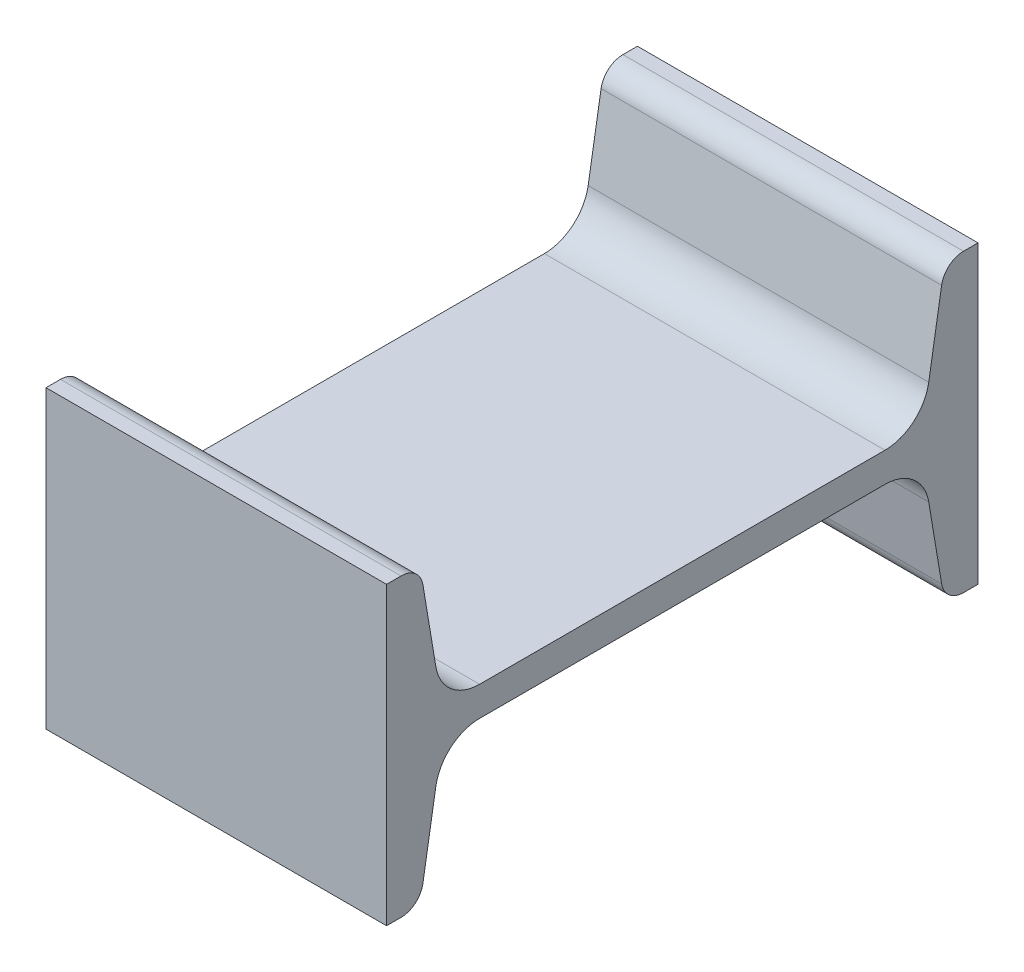
ISO-10303-21;
HEADER;
FILE_DESCRIPTION(('STEP AP214'),'2;1');
FILE_NAME('part.step','',(''),(''),'','','');
FILE_SCHEMA(('AUTOMOTIVE_DESIGN { 1 0 10303 214 1 1 1 1 }'));
ENDSEC;
DATA;
#1=APPLICATION_CONTEXT('core data for automotive mechanical design processes');
#2=APPLICATION_PROTOCOL_DEFINITION('international standard','automotive_design',2000,#1);
#3=PRODUCT_CONTEXT('',#1,'mechanical');
#4=PRODUCT('Part','Part','',(#3));
#5=PRODUCT_RELATED_PRODUCT_CATEGORY('part','',(#4));
#6=PRODUCT_DEFINITION_FORMATION('','',#4);
#7=PRODUCT_DEFINITION_CONTEXT('part definition',#1,'design');
#8=PRODUCT_DEFINITION('design','',#6,#7);
#9=PRODUCT_DEFINITION_SHAPE('','',#8);
#10=(LENGTH_UNIT() NAMED_UNIT(*) SI_UNIT(.MILLI.,.METRE.));
#11=(NAMED_UNIT(*) PLANE_ANGLE_UNIT() SI_UNIT($,.RADIAN.));
#12=(NAMED_UNIT(*) SI_UNIT($,.STERADIAN.) SOLID_ANGLE_UNIT());
#13=UNCERTAINTY_MEASURE_WITH_UNIT(LENGTH_MEASURE(1.E-05),#10,'distance_accuracy_value','');
#14=(GEOMETRIC_REPRESENTATION_CONTEXT(3) GLOBAL_UNCERTAINTY_ASSIGNED_CONTEXT((#13)) GLOBAL_UNIT_ASSIGNED_CONTEXT((#10,
#11,#12)) REPRESENTATION_CONTEXT('',''));
#15=CARTESIAN_POINT('',(0.,0.,0.));
#16=DIRECTION('',(0.,0.,1.));
#17=DIRECTION('',(1.,0.,0.));
#18=AXIS2_PLACEMENT_3D('',#15,#16,#17);
#19=CARTESIAN_POINT('',(46.0686109738013,20.,-40.));
#20=DIRECTION('',(0.,0.,1.));
#21=DIRECTION('',(1.,0.,0.));
#22=AXIS2_PLACEMENT_3D('',#19,#20,#21);
#23=PLANE('',#22);
#24=DIRECTION('',(0.,1.,0.));
#25=VECTOR('',#24,1.);
#26=CARTESIAN_POINT('',(0.,20.,-40.));
#27=LINE('',#26,#25);
#28=CARTESIAN_POINT('',(0.,-20.,-40.));
#29=VERTEX_POINT('',#28);
#30=CARTESIAN_POINT('',(0.,20.,-40.));
#31=VERTEX_POINT('',#30);
#32=EDGE_CURVE('E267',#29,#31,#27,.T.);
#33=ORIENTED_EDGE('',*,*,#32,.T.);
#34=DIRECTION('',(-1.,0.,0.));
#35=VECTOR('',#34,1.);
#36=CARTESIAN_POINT('',(46.0686109738013,20.,-40.));
#37=LINE('',#36,#35);
#38=CARTESIAN_POINT('',(46.0686109738013,20.,-40.));
#39=VERTEX_POINT('',#38);
#40=EDGE_CURVE('E13',#39,#31,#37,.T.);
#41=ORIENTED_EDGE('',*,*,#40,.F.);
#42=DIRECTION('',(0.,1.,0.));
#43=VECTOR('',#42,1.);
#44=CARTESIAN_POINT('',(46.0686109738013,20.,-40.));
#45=LINE('',#44,#43);
#46=CARTESIAN_POINT('',(46.0686109738013,-20.,-40.));
#47=VERTEX_POINT('',#46);
#48=EDGE_CURVE('E305',#47,#39,#45,.T.);
#49=ORIENTED_EDGE('',*,*,#48,.F.);
#50=DIRECTION('',(-1.,0.,0.));
#51=VECTOR('',#50,1.);
#52=CARTESIAN_POINT('',(46.0686109738013,-20.,-40.));
#53=LINE('',#52,#51);
#54=EDGE_CURVE('E263',#47,#29,#53,.T.);
#55=ORIENTED_EDGE('',*,*,#54,.T.);
#56=EDGE_LOOP('',(#33,#41,#49,#55));
#57=FACE_BOUND('',#56,.T.);
#58=ADVANCED_FACE('F99',(#57),#23,.F.);
#59=CARTESIAN_POINT('',(46.0686109738013,20.,-38.0414602103931));
#60=DIRECTION('',(0.,-1.,0.));
#61=DIRECTION('',(0.,0.,-1.));
#62=AXIS2_PLACEMENT_3D('',#59,#60,#61);
#63=PLANE('',#62);
#64=DIRECTION('',(0.,0.,1.));
#65=VECTOR('',#64,1.);
#66=CARTESIAN_POINT('',(0.,20.,-38.0414602103931));
#67=LINE('',#66,#65);
#68=CARTESIAN_POINT('',(0.,20.,-38.0414602103931));
#69=VERTEX_POINT('',#68);
#70=EDGE_CURVE('E270',#31,#69,#67,.T.);
#71=ORIENTED_EDGE('',*,*,#70,.T.);
#72=DIRECTION('',(-1.,0.,0.));
#73=VECTOR('',#72,1.);
#74=CARTESIAN_POINT('',(46.0686109738013,20.,-38.0414602103931));
#75=LINE('',#74,#73);
#76=CARTESIAN_POINT('',(46.0686109738013,20.,-38.0414602103931));
#77=VERTEX_POINT('',#76);
#78=EDGE_CURVE('E107',#77,#69,#75,.T.);
#79=ORIENTED_EDGE('',*,*,#78,.F.);
#80=DIRECTION('',(0.,0.,1.));
#81=VECTOR('',#80,1.);
#82=CARTESIAN_POINT('',(46.0686109738013,20.,-38.0414602103931));
#83=LINE('',#82,#81);
#84=EDGE_CURVE('E194',#39,#77,#83,.T.);
#85=ORIENTED_EDGE('',*,*,#84,.F.);
#86=ORIENTED_EDGE('',*,*,#40,.T.);
#87=EDGE_LOOP('',(#71,#79,#85,#86));
#88=FACE_BOUND('',#87,.T.);
#89=ADVANCED_FACE('F423',(#88),#63,.F.);
#90=CARTESIAN_POINT('',(46.0686109738013,17.,-38.0414602103931));
#91=DIRECTION('',(-1.,0.,0.));
#92=DIRECTION('',(0.,0.,1.));
#93=AXIS2_PLACEMENT_3D('',#90,#91,#92);
#94=CYLINDRICAL_SURFACE('',#93,3.);
#95=CARTESIAN_POINT('',(0.,17.,-38.0414602103931));
#96=DIRECTION('',(1.,0.,0.));
#97=DIRECTION('',(0.,0.,-1.));
#98=AXIS2_PLACEMENT_3D('',#95,#96,#97);
#99=CIRCLE('',#98,3.);
#100=CARTESIAN_POINT('',(0.,17.4932319681189,-35.0822842734766));
#101=VERTEX_POINT('',#100);
#102=EDGE_CURVE('E272',#69,#101,#99,.T.);
#103=ORIENTED_EDGE('',*,*,#102,.T.);
#104=DIRECTION('',(-1.,0.,0.));
#105=VECTOR('',#104,1.);
#106=CARTESIAN_POINT('',(46.0686109738013,17.4932319681189,-35.0822842734766));
#107=LINE('',#106,#105);
#108=CARTESIAN_POINT('',(46.0686109738013,17.4932319681189,-35.0822842734766));
#109=VERTEX_POINT('',#108);
#110=EDGE_CURVE('E348',#109,#101,#107,.T.);
#111=ORIENTED_EDGE('',*,*,#110,.F.);
#112=CARTESIAN_POINT('',(46.0686109738013,17.,-38.0414602103931));
#113=DIRECTION('',(1.,0.,0.));
#114=DIRECTION('',(0.,0.,-1.));
#115=AXIS2_PLACEMENT_3D('',#112,#113,#114);
#116=CIRCLE('',#115,3.);
#117=EDGE_CURVE('E356',#77,#109,#116,.T.);
#118=ORIENTED_EDGE('',*,*,#117,.F.);
#119=ORIENTED_EDGE('',*,*,#78,.T.);
#120=EDGE_LOOP('',(#103,#111,#118,#119));
#121=FACE_BOUND('',#120,.T.);
#122=ADVANCED_FACE('F354',(#121),#94,.T.);
#123=CARTESIAN_POINT('',(46.0686109738013,7.01353606376226,-33.335540873833));
#124=DIRECTION('',(0.,-0.164410656039623,-0.986391978972163));
#125=DIRECTION('',(0.,0.986391978972163,-0.164410656039623));
#126=AXIS2_PLACEMENT_3D('',#123,#124,#125);
#127=PLANE('',#126);
#128=DIRECTION('',(0.,-0.986391978972163,0.164410656039623));
#129=VECTOR('',#128,1.);
#130=CARTESIAN_POINT('',(0.,7.01353606376226,-33.335540873833));
#131=LINE('',#130,#129);
#132=CARTESIAN_POINT('',(0.,7.01353606376226,-33.335540873833));
#133=VERTEX_POINT('',#132);
#134=EDGE_CURVE('E274',#101,#133,#131,.T.);
#135=ORIENTED_EDGE('',*,*,#134,.T.);
#136=DIRECTION('',(-1.,0.,0.));
#137=VECTOR('',#136,1.);
#138=CARTESIAN_POINT('',(46.0686109738013,7.01353606376226,-33.335540873833));
#139=LINE('',#138,#137);
#140=CARTESIAN_POINT('',(46.0686109738013,7.01353606376226,-33.335540873833));
#141=VERTEX_POINT('',#140);
#142=EDGE_CURVE('E345',#141,#133,#139,.T.);
#143=ORIENTED_EDGE('',*,*,#142,.F.);
#144=DIRECTION('',(0.,-0.986391978972163,0.164410656039623));
#145=VECTOR('',#144,1.);
#146=CARTESIAN_POINT('',(46.0686109738013,7.01353606376226,-33.335540873833));
#147=LINE('',#146,#145);
#148=EDGE_CURVE('E374',#109,#141,#147,.T.);
#149=ORIENTED_EDGE('',*,*,#148,.F.);
#150=ORIENTED_EDGE('',*,*,#110,.T.);
#151=EDGE_LOOP('',(#135,#143,#149,#150));
#152=FACE_BOUND('',#151,.T.);
#153=ADVANCED_FACE('F365',(#152),#127,.F.);
#154=CARTESIAN_POINT('',(46.0686109738013,8.,-27.417189));
#155=DIRECTION('',(-1.,0.,0.));
#156=DIRECTION('',(0.,0.,1.));
#157=AXIS2_PLACEMENT_3D('',#154,#155,#156);
#158=CYLINDRICAL_SURFACE('',#157,6.);
#159=CARTESIAN_POINT('',(0.,8.,-27.417189));
#160=DIRECTION('',(-1.,0.,0.));
#161=DIRECTION('',(0.,0.,-1.));
#162=AXIS2_PLACEMENT_3D('',#159,#160,#161);
#163=CIRCLE('',#162,6.);
#164=CARTESIAN_POINT('',(0.,2.,-27.417189));
#165=VERTEX_POINT('',#164);
#166=EDGE_CURVE('E276',#133,#165,#163,.T.);
#167=ORIENTED_EDGE('',*,*,#166,.T.);
#168=DIRECTION('',(-1.,0.,0.));
#169=VECTOR('',#168,1.);
#170=CARTESIAN_POINT('',(46.0686109738013,2.,-27.417189));
#171=LINE('',#170,#169);
#172=CARTESIAN_POINT('',(46.0686109738013,2.,-27.417189));
#173=VERTEX_POINT('',#172);
#174=EDGE_CURVE('E342',#173,#165,#171,.T.);
#175=ORIENTED_EDGE('',*,*,#174,.F.);
#176=CARTESIAN_POINT('',(46.0686109738013,8.,-27.417189));
#177=DIRECTION('',(-1.,0.,0.));
#178=DIRECTION('',(0.,0.,-1.));
#179=AXIS2_PLACEMENT_3D('',#176,#177,#178);
#180=CIRCLE('',#179,6.);
#181=EDGE_CURVE('E371',#141,#173,#180,.T.);
#182=ORIENTED_EDGE('',*,*,#181,.F.);
#183=ORIENTED_EDGE('',*,*,#142,.T.);
#184=EDGE_LOOP('',(#167,#175,#182,#183));
#185=FACE_BOUND('',#184,.T.);
#186=ADVANCED_FACE('F369',(#185),#158,.F.);
#187=CARTESIAN_POINT('',(46.0686109738013,2.,27.417189));
#188=DIRECTION('',(0.,-1.,0.));
#189=DIRECTION('',(0.,0.,-1.));
#190=AXIS2_PLACEMENT_3D('',#187,#188,#189);
#191=PLANE('',#190);
#192=DIRECTION('',(0.,0.,1.));
#193=VECTOR('',#192,1.);
#194=CARTESIAN_POINT('',(0.,2.,27.417189));
#195=LINE('',#194,#193);
#196=CARTESIAN_POINT('',(0.,2.,27.417189));
#197=VERTEX_POINT('',#196);
#198=EDGE_CURVE('E278',#165,#197,#195,.T.);
#199=ORIENTED_EDGE('',*,*,#198,.T.);
#200=DIRECTION('',(-1.,0.,0.));
#201=VECTOR('',#200,1.);
#202=CARTESIAN_POINT('',(46.0686109738013,2.,27.417189));
#203=LINE('',#202,#201);
#204=CARTESIAN_POINT('',(46.0686109738013,2.,27.417189));
#205=VERTEX_POINT('',#204);
#206=EDGE_CURVE('E339',#205,#197,#203,.T.);
#207=ORIENTED_EDGE('',*,*,#206,.F.);
#208=DIRECTION('',(0.,0.,1.));
#209=VECTOR('',#208,1.);
#210=CARTESIAN_POINT('',(46.0686109738013,2.,27.417189));
#211=LINE('',#210,#209);
#212=EDGE_CURVE('E373',#173,#205,#211,.T.);
#213=ORIENTED_EDGE('',*,*,#212,.F.);
#214=ORIENTED_EDGE('',*,*,#174,.T.);
#215=EDGE_LOOP('',(#199,#207,#213,#214));
#216=FACE_BOUND('',#215,.T.);
#217=ADVANCED_FACE('F436',(#216),#191,.F.);
#218=CARTESIAN_POINT('',(46.0686109738013,8.00000000000001,27.417189));
#219=DIRECTION('',(-1.,0.,0.));
#220=DIRECTION('',(0.,0.,1.));
#221=AXIS2_PLACEMENT_3D('',#218,#219,#220);
#222=CYLINDRICAL_SURFACE('',#221,6.);
#223=CARTESIAN_POINT('',(0.,8.00000000000001,27.417189));
#224=DIRECTION('',(-1.,0.,0.));
#225=DIRECTION('',(0.,0.,-1.));
#226=AXIS2_PLACEMENT_3D('',#223,#224,#225);
#227=CIRCLE('',#226,6.);
#228=CARTESIAN_POINT('',(0.,7.01353606376227,33.335540873833));
#229=VERTEX_POINT('',#228);
#230=EDGE_CURVE('E280',#197,#229,#227,.T.);
#231=ORIENTED_EDGE('',*,*,#230,.T.);
#232=DIRECTION('',(-1.,0.,0.));
#233=VECTOR('',#232,1.);
#234=CARTESIAN_POINT('',(46.0686109738013,7.01353606376227,33.335540873833));
#235=LINE('',#234,#233);
#236=CARTESIAN_POINT('',(46.0686109738013,7.01353606376227,33.335540873833));
#237=VERTEX_POINT('',#236);
#238=EDGE_CURVE('E336',#237,#229,#235,.T.);
#239=ORIENTED_EDGE('',*,*,#238,.F.);
#240=CARTESIAN_POINT('',(46.0686109738013,8.00000000000001,27.417189));
#241=DIRECTION('',(-1.,0.,0.));
#242=DIRECTION('',(0.,0.,-1.));
#243=AXIS2_PLACEMENT_3D('',#240,#241,#242);
#244=CIRCLE('',#243,6.);
#245=EDGE_CURVE('E376',#205,#237,#244,.T.);
#246=ORIENTED_EDGE('',*,*,#245,.F.);
#247=ORIENTED_EDGE('',*,*,#206,.T.);
#248=EDGE_LOOP('',(#231,#239,#246,#247));
#249=FACE_BOUND('',#248,.T.);
#250=ADVANCED_FACE('F439',(#249),#222,.F.);
#251=CARTESIAN_POINT('',(46.0686109738013,17.4932319681189,35.0822842734766));
#252=DIRECTION('',(0.,-0.164410656039622,0.986391978972163));
#253=DIRECTION('',(0.,-0.986391978972164,-0.164410656039622));
#254=AXIS2_PLACEMENT_3D('',#251,#252,#253);
#255=PLANE('',#254);
#256=DIRECTION('',(0.,0.986391978972163,0.164410656039622));
#257=VECTOR('',#256,1.);
#258=CARTESIAN_POINT('',(0.,17.4932319681189,35.0822842734766));
#259=LINE('',#258,#257);
#260=CARTESIAN_POINT('',(0.,17.4932319681189,35.0822842734766));
#261=VERTEX_POINT('',#260);
#262=EDGE_CURVE('E282',#229,#261,#259,.T.);
#263=ORIENTED_EDGE('',*,*,#262,.T.);
#264=DIRECTION('',(-1.,0.,0.));
#265=VECTOR('',#264,1.);
#266=CARTESIAN_POINT('',(46.0686109738013,17.4932319681189,35.0822842734766));
#267=LINE('',#266,#265);
#268=CARTESIAN_POINT('',(46.0686109738013,17.4932319681189,35.0822842734766));
#269=VERTEX_POINT('',#268);
#270=EDGE_CURVE('E333',#269,#261,#267,.T.);
#271=ORIENTED_EDGE('',*,*,#270,.F.);
#272=DIRECTION('',(0.,0.986391978972163,0.164410656039622));
#273=VECTOR('',#272,1.);
#274=CARTESIAN_POINT('',(46.0686109738013,17.4932319681189,35.0822842734766));
#275=LINE('',#274,#273);
#276=EDGE_CURVE('E382',#237,#269,#275,.T.);
#277=ORIENTED_EDGE('',*,*,#276,.F.);
#278=ORIENTED_EDGE('',*,*,#238,.T.);
#279=EDGE_LOOP('',(#263,#271,#277,#278));
#280=FACE_BOUND('',#279,.T.);
#281=ADVANCED_FACE('F443',(#280),#255,.F.);
#282=CARTESIAN_POINT('',(46.0686109738013,17.,38.0414602103931));
#283=DIRECTION('',(-1.,0.,0.));
#284=DIRECTION('',(0.,0.,1.));
#285=AXIS2_PLACEMENT_3D('',#282,#283,#284);
#286=CYLINDRICAL_SURFACE('',#285,3.);
#287=CARTESIAN_POINT('',(0.,17.,38.0414602103931));
#288=DIRECTION('',(1.,0.,0.));
#289=DIRECTION('',(0.,0.,-1.));
#290=AXIS2_PLACEMENT_3D('',#287,#288,#289);
#291=CIRCLE('',#290,3.);
#292=CARTESIAN_POINT('',(0.,20.,38.0414602103931));
#293=VERTEX_POINT('',#292);
#294=EDGE_CURVE('E284',#261,#293,#291,.T.);
#295=ORIENTED_EDGE('',*,*,#294,.T.);
#296=DIRECTION('',(-1.,0.,0.));
#297=VECTOR('',#296,1.);
#298=CARTESIAN_POINT('',(46.0686109738013,20.,38.0414602103931));
#299=LINE('',#298,#297);
#300=CARTESIAN_POINT('',(46.0686109738013,20.,38.0414602103931));
#301=VERTEX_POINT('',#300);
#302=EDGE_CURVE('E330',#301,#293,#299,.T.);
#303=ORIENTED_EDGE('',*,*,#302,.F.);
#304=CARTESIAN_POINT('',(46.0686109738013,17.,38.0414602103931));
#305=DIRECTION('',(1.,0.,0.));
#306=DIRECTION('',(0.,0.,-1.));
#307=AXIS2_PLACEMENT_3D('',#304,#305,#306);
#308=CIRCLE('',#307,3.);
#309=EDGE_CURVE('E384',#269,#301,#308,.T.);
#310=ORIENTED_EDGE('',*,*,#309,.F.);
#311=ORIENTED_EDGE('',*,*,#270,.T.);
#312=EDGE_LOOP('',(#295,#303,#310,#311));
#313=FACE_BOUND('',#312,.T.);
#314=ADVANCED_FACE('F447',(#313),#286,.T.);
#315=CARTESIAN_POINT('',(46.0686109738013,20.,40.));
#316=DIRECTION('',(0.,-1.,0.));
#317=DIRECTION('',(0.,0.,-1.));
#318=AXIS2_PLACEMENT_3D('',#315,#316,#317);
#319=PLANE('',#318);
#320=DIRECTION('',(0.,0.,1.));
#321=VECTOR('',#320,1.);
#322=CARTESIAN_POINT('',(0.,20.,40.));
#323=LINE('',#322,#321);
#324=CARTESIAN_POINT('',(0.,20.,40.));
#325=VERTEX_POINT('',#324);
#326=EDGE_CURVE('E286',#293,#325,#323,.T.);
#327=ORIENTED_EDGE('',*,*,#326,.T.);
#328=DIRECTION('',(-1.,0.,0.));
#329=VECTOR('',#328,1.);
#330=CARTESIAN_POINT('',(46.0686109738013,20.,40.));
#331=LINE('',#330,#329);
#332=CARTESIAN_POINT('',(46.0686109738013,20.,40.));
#333=VERTEX_POINT('',#332);
#334=EDGE_CURVE('E327',#333,#325,#331,.T.);
#335=ORIENTED_EDGE('',*,*,#334,.F.);
#336=DIRECTION('',(0.,0.,1.));
#337=VECTOR('',#336,1.);
#338=CARTESIAN_POINT('',(46.0686109738013,20.,40.));
#339=LINE('',#338,#337);
#340=EDGE_CURVE('E386',#301,#333,#339,.T.);
#341=ORIENTED_EDGE('',*,*,#340,.F.);
#342=ORIENTED_EDGE('',*,*,#302,.T.);
#343=EDGE_LOOP('',(#327,#335,#341,#342));
#344=FACE_BOUND('',#343,.T.);
#345=ADVANCED_FACE('F451',(#344),#319,.F.);
#346=CARTESIAN_POINT('',(46.0686109738013,-20.,40.));
#347=DIRECTION('',(0.,0.,-1.));
#348=DIRECTION('',(0.,1.,0.));
#349=AXIS2_PLACEMENT_3D('',#346,#347,#348);
#350=PLANE('',#349);
#351=DIRECTION('',(0.,-1.,0.));
#352=VECTOR('',#351,1.);
#353=CARTESIAN_POINT('',(0.,-20.,40.));
#354=LINE('',#353,#352);
#355=CARTESIAN_POINT('',(0.,-20.,40.));
#356=VERTEX_POINT('',#355);
#357=EDGE_CURVE('E288',#325,#356,#354,.T.);
#358=ORIENTED_EDGE('',*,*,#357,.T.);
#359=DIRECTION('',(-1.,0.,0.));
#360=VECTOR('',#359,1.);
#361=CARTESIAN_POINT('',(46.0686109738013,-20.,40.));
#362=LINE('',#361,#360);
#363=CARTESIAN_POINT('',(46.0686109738013,-20.,40.));
#364=VERTEX_POINT('',#363);
#365=EDGE_CURVE('E324',#364,#356,#362,.T.);
#366=ORIENTED_EDGE('',*,*,#365,.F.);
#367=DIRECTION('',(0.,-1.,0.));
#368=VECTOR('',#367,1.);
#369=CARTESIAN_POINT('',(46.0686109738013,-20.,40.));
#370=LINE('',#369,#368);
#371=EDGE_CURVE('E388',#333,#364,#370,.T.);
#372=ORIENTED_EDGE('',*,*,#371,.F.);
#373=ORIENTED_EDGE('',*,*,#334,.T.);
#374=EDGE_LOOP('',(#358,#366,#372,#373));
#375=FACE_BOUND('',#374,.T.);
#376=ADVANCED_FACE('F455',(#375),#350,.F.);
#377=CARTESIAN_POINT('',(46.0686109738013,-20.,38.0414602103931));
#378=DIRECTION('',(0.,1.,0.));
#379=DIRECTION('',(0.,0.,1.));
#380=AXIS2_PLACEMENT_3D('',#377,#378,#379);
#381=PLANE('',#380);
#382=DIRECTION('',(0.,0.,-1.));
#383=VECTOR('',#382,1.);
#384=CARTESIAN_POINT('',(0.,-20.,38.0414602103931));
#385=LINE('',#384,#383);
#386=CARTESIAN_POINT('',(0.,-20.,38.0414602103931));
#387=VERTEX_POINT('',#386);
#388=EDGE_CURVE('E290',#356,#387,#385,.T.);
#389=ORIENTED_EDGE('',*,*,#388,.T.);
#390=DIRECTION('',(-1.,0.,0.));
#391=VECTOR('',#390,1.);
#392=CARTESIAN_POINT('',(46.0686109738013,-20.,38.0414602103931));
#393=LINE('',#392,#391);
#394=CARTESIAN_POINT('',(46.0686109738013,-20.,38.0414602103931));
#395=VERTEX_POINT('',#394);
#396=EDGE_CURVE('E321',#395,#387,#393,.T.);
#397=ORIENTED_EDGE('',*,*,#396,.F.);
#398=DIRECTION('',(0.,0.,-1.));
#399=VECTOR('',#398,1.);
#400=CARTESIAN_POINT('',(46.0686109738013,-20.,38.0414602103931));
#401=LINE('',#400,#399);
#402=EDGE_CURVE('E390',#364,#395,#401,.T.);
#403=ORIENTED_EDGE('',*,*,#402,.F.);
#404=ORIENTED_EDGE('',*,*,#365,.T.);
#405=EDGE_LOOP('',(#389,#397,#403,#404));
#406=FACE_BOUND('',#405,.T.);
#407=ADVANCED_FACE('F459',(#406),#381,.F.);
#408=CARTESIAN_POINT('',(46.0686109738013,-17.,38.0414602103931));
#409=DIRECTION('',(-1.,0.,0.));
#410=DIRECTION('',(0.,0.,1.));
#411=AXIS2_PLACEMENT_3D('',#408,#409,#410);
#412=CYLINDRICAL_SURFACE('',#411,3.);
#413=CARTESIAN_POINT('',(0.,-17.,38.0414602103931));
#414=DIRECTION('',(1.,0.,0.));
#415=DIRECTION('',(0.,0.,1.));
#416=AXIS2_PLACEMENT_3D('',#413,#414,#415);
#417=CIRCLE('',#416,3.);
#418=CARTESIAN_POINT('',(0.,-17.4932319681189,35.0822842734766));
#419=VERTEX_POINT('',#418);
#420=EDGE_CURVE('E292',#387,#419,#417,.T.);
#421=ORIENTED_EDGE('',*,*,#420,.T.);
#422=DIRECTION('',(-1.,0.,0.));
#423=VECTOR('',#422,1.);
#424=CARTESIAN_POINT('',(46.0686109738013,-17.4932319681189,35.0822842734766));
#425=LINE('',#424,#423);
#426=CARTESIAN_POINT('',(46.0686109738013,-17.4932319681189,35.0822842734766));
#427=VERTEX_POINT('',#426);
#428=EDGE_CURVE('E318',#427,#419,#425,.T.);
#429=ORIENTED_EDGE('',*,*,#428,.F.);
#430=CARTESIAN_POINT('',(46.0686109738013,-17.,38.0414602103931));
#431=DIRECTION('',(1.,0.,0.));
#432=DIRECTION('',(0.,0.,1.));
#433=AXIS2_PLACEMENT_3D('',#430,#431,#432);
#434=CIRCLE('',#433,3.);
#435=EDGE_CURVE('E392',#395,#427,#434,.T.);
#436=ORIENTED_EDGE('',*,*,#435,.F.);
#437=ORIENTED_EDGE('',*,*,#396,.T.);
#438=EDGE_LOOP('',(#421,#429,#436,#437));
#439=FACE_BOUND('',#438,.T.);
#440=ADVANCED_FACE('F463',(#439),#412,.T.);
#441=CARTESIAN_POINT('',(46.0686109738013,-7.01353606376226,33.335540873833));
#442=DIRECTION('',(0.,0.164410656039623,0.986391978972163));
#443=DIRECTION('',(0.,-0.986391978972163,0.164410656039623));
#444=AXIS2_PLACEMENT_3D('',#441,#442,#443);
#445=PLANE('',#444);
#446=DIRECTION('',(0.,0.986391978972163,-0.164410656039623));
#447=VECTOR('',#446,1.);
#448=CARTESIAN_POINT('',(0.,-7.01353606376226,33.335540873833));
#449=LINE('',#448,#447);
#450=CARTESIAN_POINT('',(0.,-7.01353606376226,33.335540873833));
#451=VERTEX_POINT('',#450);
#452=EDGE_CURVE('E294',#419,#451,#449,.T.);
#453=ORIENTED_EDGE('',*,*,#452,.T.);
#454=DIRECTION('',(-1.,0.,0.));
#455=VECTOR('',#454,1.);
#456=CARTESIAN_POINT('',(46.0686109738013,-7.01353606376226,33.335540873833));
#457=LINE('',#456,#455);
#458=CARTESIAN_POINT('',(46.0686109738013,-7.01353606376226,33.335540873833));
#459=VERTEX_POINT('',#458);
#460=EDGE_CURVE('E315',#459,#451,#457,.T.);
#461=ORIENTED_EDGE('',*,*,#460,.F.);
#462=DIRECTION('',(0.,0.986391978972163,-0.164410656039623));
#463=VECTOR('',#462,1.);
#464=CARTESIAN_POINT('',(46.0686109738013,-7.01353606376226,33.335540873833));
#465=LINE('',#464,#463);
#466=EDGE_CURVE('E394',#427,#459,#465,.T.);
#467=ORIENTED_EDGE('',*,*,#466,.F.);
#468=ORIENTED_EDGE('',*,*,#428,.T.);
#469=EDGE_LOOP('',(#453,#461,#467,#468));
#470=FACE_BOUND('',#469,.T.);
#471=ADVANCED_FACE('F467',(#470),#445,.F.);
#472=CARTESIAN_POINT('',(46.0686109738013,-7.99999999999999,27.417189));
#473=DIRECTION('',(-1.,0.,0.));
#474=DIRECTION('',(0.,0.,1.));
#475=AXIS2_PLACEMENT_3D('',#472,#473,#474);
#476=CYLINDRICAL_SURFACE('',#475,6.);
#477=CARTESIAN_POINT('',(0.,-7.99999999999999,27.417189));
#478=DIRECTION('',(-1.,0.,0.));
#479=DIRECTION('',(0.,0.,-1.));
#480=AXIS2_PLACEMENT_3D('',#477,#478,#479);
#481=CIRCLE('',#480,6.);
#482=CARTESIAN_POINT('',(0.,-2.,27.417189));
#483=VERTEX_POINT('',#482);
#484=EDGE_CURVE('E296',#451,#483,#481,.T.);
#485=ORIENTED_EDGE('',*,*,#484,.T.);
#486=DIRECTION('',(-1.,0.,0.));
#487=VECTOR('',#486,1.);
#488=CARTESIAN_POINT('',(46.0686109738013,-2.,27.417189));
#489=LINE('',#488,#487);
#490=CARTESIAN_POINT('',(46.0686109738013,-2.,27.417189));
#491=VERTEX_POINT('',#490);
#492=EDGE_CURVE('E312',#491,#483,#489,.T.);
#493=ORIENTED_EDGE('',*,*,#492,.F.);
#494=CARTESIAN_POINT('',(46.0686109738013,-7.99999999999999,27.417189));
#495=DIRECTION('',(-1.,0.,0.));
#496=DIRECTION('',(0.,0.,-1.));
#497=AXIS2_PLACEMENT_3D('',#494,#495,#496);
#498=CIRCLE('',#497,6.);
#499=EDGE_CURVE('E396',#459,#491,#498,.T.);
#500=ORIENTED_EDGE('',*,*,#499,.F.);
#501=ORIENTED_EDGE('',*,*,#460,.T.);
#502=EDGE_LOOP('',(#485,#493,#500,#501));
#503=FACE_BOUND('',#502,.T.);
#504=ADVANCED_FACE('F471',(#503),#476,.F.);
#505=CARTESIAN_POINT('',(46.0686109738013,-2.,-27.417189));
#506=DIRECTION('',(0.,1.,0.));
#507=DIRECTION('',(0.,0.,1.));
#508=AXIS2_PLACEMENT_3D('',#505,#506,#507);
#509=PLANE('',#508);
#510=DIRECTION('',(0.,0.,-1.));
#511=VECTOR('',#510,1.);
#512=CARTESIAN_POINT('',(0.,-2.,-27.417189));
#513=LINE('',#512,#511);
#514=CARTESIAN_POINT('',(0.,-2.,-27.417189));
#515=VERTEX_POINT('',#514);
#516=EDGE_CURVE('E298',#483,#515,#513,.T.);
#517=ORIENTED_EDGE('',*,*,#516,.T.);
#518=DIRECTION('',(-1.,0.,0.));
#519=VECTOR('',#518,1.);
#520=CARTESIAN_POINT('',(46.0686109738013,-2.,-27.417189));
#521=LINE('',#520,#519);
#522=CARTESIAN_POINT('',(46.0686109738013,-2.,-27.417189));
#523=VERTEX_POINT('',#522);
#524=EDGE_CURVE('E309',#523,#515,#521,.T.);
#525=ORIENTED_EDGE('',*,*,#524,.F.);
#526=DIRECTION('',(0.,0.,-1.));
#527=VECTOR('',#526,1.);
#528=CARTESIAN_POINT('',(46.0686109738013,-2.,-27.417189));
#529=LINE('',#528,#527);
#530=EDGE_CURVE('E398',#491,#523,#529,.T.);
#531=ORIENTED_EDGE('',*,*,#530,.F.);
#532=ORIENTED_EDGE('',*,*,#492,.T.);
#533=EDGE_LOOP('',(#517,#525,#531,#532));
#534=FACE_BOUND('',#533,.T.);
#535=ADVANCED_FACE('F404',(#534),#509,.F.);
#536=CARTESIAN_POINT('',(46.0686109738013,-8.,-27.417189));
#537=DIRECTION('',(-1.,0.,0.));
#538=DIRECTION('',(0.,0.,1.));
#539=AXIS2_PLACEMENT_3D('',#536,#537,#538);
#540=CYLINDRICAL_SURFACE('',#539,6.);
#541=CARTESIAN_POINT('',(0.,-8.,-27.417189));
#542=DIRECTION('',(-1.,0.,0.));
#543=DIRECTION('',(0.,0.,-1.));
#544=AXIS2_PLACEMENT_3D('',#541,#542,#543);
#545=CIRCLE('',#544,6.);
#546=CARTESIAN_POINT('',(0.,-7.01353606376226,-33.335540873833));
#547=VERTEX_POINT('',#546);
#548=EDGE_CURVE('E300',#515,#547,#545,.T.);
#549=ORIENTED_EDGE('',*,*,#548,.T.);
#550=DIRECTION('',(-1.,0.,0.));
#551=VECTOR('',#550,1.);
#552=CARTESIAN_POINT('',(46.0686109738013,-7.01353606376226,-33.335540873833));
#553=LINE('',#552,#551);
#554=CARTESIAN_POINT('',(46.0686109738013,-7.01353606376226,-33.335540873833));
#555=VERTEX_POINT('',#554);
#556=EDGE_CURVE('E258',#555,#547,#553,.T.);
#557=ORIENTED_EDGE('',*,*,#556,.F.);
#558=CARTESIAN_POINT('',(46.0686109738013,-8.,-27.417189));
#559=DIRECTION('',(-1.,0.,0.));
#560=DIRECTION('',(0.,0.,-1.));
#561=AXIS2_PLACEMENT_3D('',#558,#559,#560);
#562=CIRCLE('',#561,6.);
#563=EDGE_CURVE('E249',#523,#555,#562,.T.);
#564=ORIENTED_EDGE('',*,*,#563,.F.);
#565=ORIENTED_EDGE('',*,*,#524,.T.);
#566=EDGE_LOOP('',(#549,#557,#564,#565));
#567=FACE_BOUND('',#566,.T.);
#568=ADVANCED_FACE('F408',(#567),#540,.F.);
#569=CARTESIAN_POINT('',(46.0686109738013,-17.4932319681189,-35.0822842734766));
#570=DIRECTION('',(0.,0.164410656039623,-0.986391978972163));
#571=DIRECTION('',(0.,0.986391978972163,0.164410656039623));
#572=AXIS2_PLACEMENT_3D('',#569,#570,#571);
#573=PLANE('',#572);
#574=DIRECTION('',(0.,-0.986391978972163,-0.164410656039623));
#575=VECTOR('',#574,1.);
#576=CARTESIAN_POINT('',(0.,-17.4932319681189,-35.0822842734766));
#577=LINE('',#576,#575);
#578=CARTESIAN_POINT('',(0.,-17.4932319681189,-35.0822842734766));
#579=VERTEX_POINT('',#578);
#580=EDGE_CURVE('E257',#547,#579,#577,.T.);
#581=ORIENTED_EDGE('',*,*,#580,.T.);
#582=DIRECTION('',(-1.,0.,0.));
#583=VECTOR('',#582,1.);
#584=CARTESIAN_POINT('',(46.0686109738013,-17.4932319681189,-35.0822842734766));
#585=LINE('',#584,#583);
#586=CARTESIAN_POINT('',(46.0686109738013,-17.4932319681189,-35.0822842734766));
#587=VERTEX_POINT('',#586);
#588=EDGE_CURVE('E254',#587,#579,#585,.T.);
#589=ORIENTED_EDGE('',*,*,#588,.F.);
#590=DIRECTION('',(0.,-0.986391978972163,-0.164410656039623));
#591=VECTOR('',#590,1.);
#592=CARTESIAN_POINT('',(46.0686109738013,-17.4932319681189,-35.0822842734766));
#593=LINE('',#592,#591);
#594=EDGE_CURVE('E243',#555,#587,#593,.T.);
#595=ORIENTED_EDGE('',*,*,#594,.F.);
#596=ORIENTED_EDGE('',*,*,#556,.T.);
#597=EDGE_LOOP('',(#581,#589,#595,#596));
#598=FACE_BOUND('',#597,.T.);
#599=ADVANCED_FACE('F255',(#598),#573,.F.);
#600=CARTESIAN_POINT('',(46.0686109738013,-17.,-38.0414602103931));
#601=DIRECTION('',(-1.,0.,0.));
#602=DIRECTION('',(0.,0.,1.));
#603=AXIS2_PLACEMENT_3D('',#600,#601,#602);
#604=CYLINDRICAL_SURFACE('',#603,3.);
#605=CARTESIAN_POINT('',(0.,-17.,-38.0414602103931));
#606=DIRECTION('',(1.,0.,0.));
#607=DIRECTION('',(0.,0.,1.));
#608=AXIS2_PLACEMENT_3D('',#605,#606,#607);
#609=CIRCLE('',#608,3.);
#610=CARTESIAN_POINT('',(0.,-20.,-38.0414602103931));
#611=VERTEX_POINT('',#610);
#612=EDGE_CURVE('E180',#579,#611,#609,.T.);
#613=ORIENTED_EDGE('',*,*,#612,.T.);
#614=DIRECTION('',(-1.,0.,0.));
#615=VECTOR('',#614,1.);
#616=CARTESIAN_POINT('',(46.0686109738013,-20.,-38.0414602103931));
#617=LINE('',#616,#615);
#618=CARTESIAN_POINT('',(46.0686109738013,-20.,-38.0414602103931));
#619=VERTEX_POINT('',#618);
#620=EDGE_CURVE('E259',#619,#611,#617,.T.);
#621=ORIENTED_EDGE('',*,*,#620,.F.);
#622=CARTESIAN_POINT('',(46.0686109738013,-17.,-38.0414602103931));
#623=DIRECTION('',(1.,0.,0.));
#624=DIRECTION('',(0.,0.,1.));
#625=AXIS2_PLACEMENT_3D('',#622,#623,#624);
#626=CIRCLE('',#625,3.);
#627=EDGE_CURVE('E247',#587,#619,#626,.T.);
#628=ORIENTED_EDGE('',*,*,#627,.F.);
#629=ORIENTED_EDGE('',*,*,#588,.T.);
#630=EDGE_LOOP('',(#613,#621,#628,#629));
#631=FACE_BOUND('',#630,.T.);
#632=ADVANCED_FACE('F261',(#631),#604,.T.);
#633=CARTESIAN_POINT('',(46.0686109738013,-20.,-40.));
#634=DIRECTION('',(0.,1.,0.));
#635=DIRECTION('',(0.,0.,1.));
#636=AXIS2_PLACEMENT_3D('',#633,#634,#635);
#637=PLANE('',#636);
#638=DIRECTION('',(0.,0.,-1.));
#639=VECTOR('',#638,1.);
#640=CARTESIAN_POINT('',(0.,-20.,-40.));
#641=LINE('',#640,#639);
#642=EDGE_CURVE('E186',#611,#29,#641,.T.);
#643=ORIENTED_EDGE('',*,*,#642,.T.);
#644=ORIENTED_EDGE('',*,*,#54,.F.);
#645=DIRECTION('',(0.,0.,-1.));
#646=VECTOR('',#645,1.);
#647=CARTESIAN_POINT('',(46.0686109738013,-20.,-40.));
#648=LINE('',#647,#646);
#649=EDGE_CURVE('E115',#619,#47,#648,.T.);
#650=ORIENTED_EDGE('',*,*,#649,.F.);
#651=ORIENTED_EDGE('',*,*,#620,.T.);
#652=EDGE_LOOP('',(#643,#644,#650,#651));
#653=FACE_BOUND('',#652,.T.);
#654=ADVANCED_FACE('F412',(#653),#637,.F.);
#655=CARTESIAN_POINT('',(46.0686109738013,-17.,-38.0414602103931));
#656=DIRECTION('',(-1.,0.,0.));
#657=DIRECTION('',(0.,0.,1.));
#658=AXIS2_PLACEMENT_3D('',#655,#656,#657);
#659=PLANE('',#658);
#660=ORIENTED_EDGE('',*,*,#48,.T.);
#661=ORIENTED_EDGE('',*,*,#84,.T.);
#662=ORIENTED_EDGE('',*,*,#117,.T.);
#663=ORIENTED_EDGE('',*,*,#148,.T.);
#664=ORIENTED_EDGE('',*,*,#181,.T.);
#665=ORIENTED_EDGE('',*,*,#212,.T.);
#666=ORIENTED_EDGE('',*,*,#245,.T.);
#667=ORIENTED_EDGE('',*,*,#276,.T.);
#668=ORIENTED_EDGE('',*,*,#309,.T.);
#669=ORIENTED_EDGE('',*,*,#340,.T.);
#670=ORIENTED_EDGE('',*,*,#371,.T.);
#671=ORIENTED_EDGE('',*,*,#402,.T.);
#672=ORIENTED_EDGE('',*,*,#435,.T.);
#673=ORIENTED_EDGE('',*,*,#466,.T.);
#674=ORIENTED_EDGE('',*,*,#499,.T.);
#675=ORIENTED_EDGE('',*,*,#530,.T.);
#676=ORIENTED_EDGE('',*,*,#563,.T.);
#677=ORIENTED_EDGE('',*,*,#594,.T.);
#678=ORIENTED_EDGE('',*,*,#627,.T.);
#679=ORIENTED_EDGE('',*,*,#649,.T.);
#680=EDGE_LOOP('',(#660,#661,#662,#663,#664,#665,#666,#667,#668,#669,#670,#671,#672,#673,#674,
#675,#676,#677,#678,#679));
#681=FACE_BOUND('',#680,.T.);
#682=ADVANCED_FACE('F245',(#681),#659,.F.);
#683=CARTESIAN_POINT('',(0.,-17.,-38.0414602103931));
#684=DIRECTION('',(-1.,0.,0.));
#685=DIRECTION('',(0.,0.,1.));
#686=AXIS2_PLACEMENT_3D('',#683,#684,#685);
#687=PLANE('',#686);
#688=ORIENTED_EDGE('',*,*,#32,.F.);
#689=ORIENTED_EDGE('',*,*,#642,.F.);
#690=ORIENTED_EDGE('',*,*,#612,.F.);
#691=ORIENTED_EDGE('',*,*,#580,.F.);
#692=ORIENTED_EDGE('',*,*,#548,.F.);
#693=ORIENTED_EDGE('',*,*,#516,.F.);
#694=ORIENTED_EDGE('',*,*,#484,.F.);
#695=ORIENTED_EDGE('',*,*,#452,.F.);
#696=ORIENTED_EDGE('',*,*,#420,.F.);
#697=ORIENTED_EDGE('',*,*,#388,.F.);
#698=ORIENTED_EDGE('',*,*,#357,.F.);
#699=ORIENTED_EDGE('',*,*,#326,.F.);
#700=ORIENTED_EDGE('',*,*,#294,.F.);
#701=ORIENTED_EDGE('',*,*,#262,.F.);
#702=ORIENTED_EDGE('',*,*,#230,.F.);
#703=ORIENTED_EDGE('',*,*,#198,.F.);
#704=ORIENTED_EDGE('',*,*,#166,.F.);
#705=ORIENTED_EDGE('',*,*,#134,.F.);
#706=ORIENTED_EDGE('',*,*,#102,.F.);
#707=ORIENTED_EDGE('',*,*,#70,.F.);
#708=EDGE_LOOP('',(#688,#689,#690,#691,#692,#693,#694,#695,#696,#697,#698,#699,#700,#701,#702,
#703,#704,#705,#706,#707));
#709=FACE_BOUND('',#708,.T.);
#710=ADVANCED_FACE('F360',(#709),#687,.T.);
#711=CLOSED_SHELL('',(#58,#89,#122,#153,#186,#217,#250,#281,#314,#345,#376,#407,#440,#471,#504,
#535,#568,#599,#632,#654,#682,#710));
#712=MANIFOLD_SOLID_BREP('B2',#711);
#713=ADVANCED_BREP_SHAPE_REPRESENTATION('',(#18,#712),#14);
#714=SHAPE_DEFINITION_REPRESENTATION(#9,#713);
ENDSEC;
END-ISO-10303-21;
